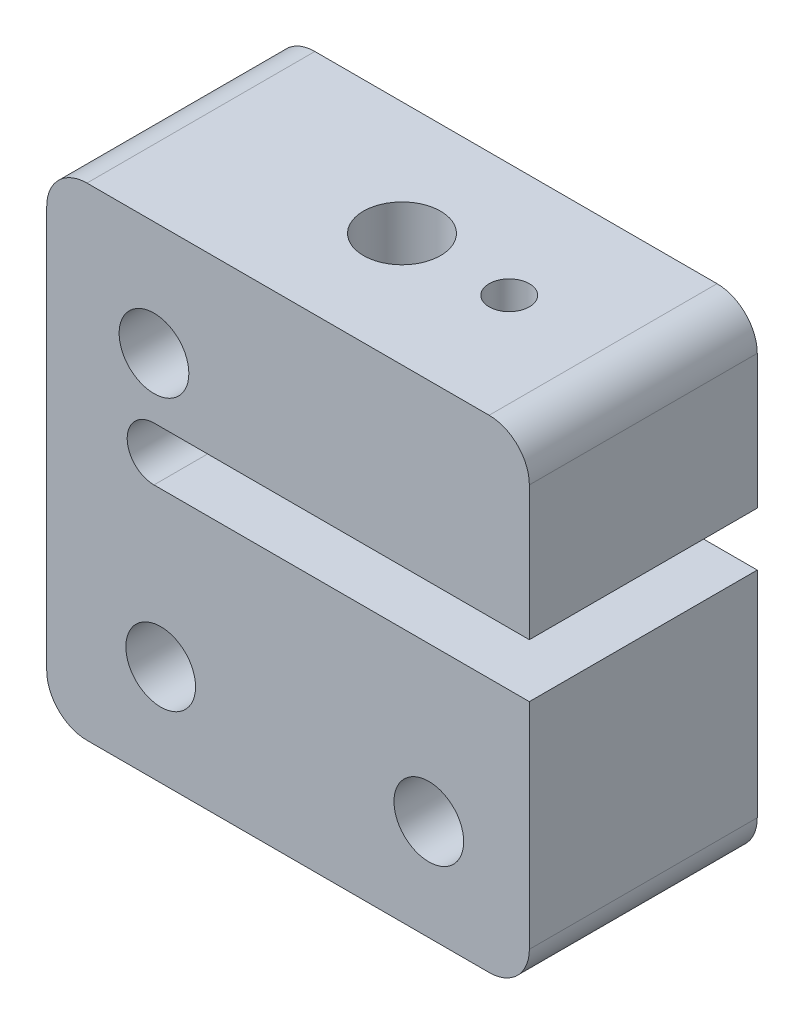
ISO-10303-21;
HEADER;
FILE_DESCRIPTION(('STEP AP214'),'2;1');
FILE_NAME('part.step','',(''),(''),'','','');
FILE_SCHEMA(('AUTOMOTIVE_DESIGN { 1 0 10303 214 1 1 1 1 }'));
ENDSEC;
DATA;
#1=APPLICATION_CONTEXT('core data for automotive mechanical design processes');
#2=APPLICATION_PROTOCOL_DEFINITION('international standard','automotive_design',2000,#1);
#3=PRODUCT_CONTEXT('',#1,'mechanical');
#4=PRODUCT('Part','Part','',(#3));
#5=PRODUCT_RELATED_PRODUCT_CATEGORY('part','',(#4));
#6=PRODUCT_DEFINITION_FORMATION('','',#4);
#7=PRODUCT_DEFINITION_CONTEXT('part definition',#1,'design');
#8=PRODUCT_DEFINITION('design','',#6,#7);
#9=PRODUCT_DEFINITION_SHAPE('','',#8);
#10=(LENGTH_UNIT() NAMED_UNIT(*) SI_UNIT(.MILLI.,.METRE.));
#11=(NAMED_UNIT(*) PLANE_ANGLE_UNIT() SI_UNIT($,.RADIAN.));
#12=(NAMED_UNIT(*) SI_UNIT($,.STERADIAN.) SOLID_ANGLE_UNIT());
#13=UNCERTAINTY_MEASURE_WITH_UNIT(LENGTH_MEASURE(1.E-05),#10,'distance_accuracy_value','');
#14=(GEOMETRIC_REPRESENTATION_CONTEXT(3) GLOBAL_UNCERTAINTY_ASSIGNED_CONTEXT((#13)) GLOBAL_UNIT_ASSIGNED_CONTEXT((#10,
#11,#12)) REPRESENTATION_CONTEXT('',''));
#15=CARTESIAN_POINT('',(0.,0.,0.));
#16=DIRECTION('',(0.,0.,1.));
#17=DIRECTION('',(1.,0.,0.));
#18=AXIS2_PLACEMENT_3D('',#15,#16,#17);
#19=CARTESIAN_POINT('',(26.,36.,8.5));
#20=DIRECTION('',(0.,-1.,0.));
#21=DIRECTION('',(0.,0.,-1.));
#22=AXIS2_PLACEMENT_3D('',#19,#20,#21);
#23=CYLINDRICAL_SURFACE('',#22,1.5);
#24=CARTESIAN_POINT('',(26.,36.,8.5));
#25=DIRECTION('',(0.,-1.,0.));
#26=DIRECTION('',(0.,0.,-1.));
#27=AXIS2_PLACEMENT_3D('',#24,#25,#26);
#28=CIRCLE('',#27,1.5);
#29=CARTESIAN_POINT('',(26.,36.,7.));
#30=VERTEX_POINT('',#29);
#31=EDGE_CURVE('E207',#30,#30,#28,.T.);
#32=ORIENTED_EDGE('',*,*,#31,.F.);
#33=EDGE_LOOP('',(#32));
#34=FACE_BOUND('',#33,.T.);
#35=CARTESIAN_POINT('',(26.,23.,8.5));
#36=DIRECTION('',(0.,-1.,0.));
#37=DIRECTION('',(0.,0.,-1.));
#38=AXIS2_PLACEMENT_3D('',#35,#36,#37);
#39=CIRCLE('',#38,1.5);
#40=CARTESIAN_POINT('',(26.,23.,7.));
#41=VERTEX_POINT('',#40);
#42=EDGE_CURVE('E215',#41,#41,#39,.F.);
#43=ORIENTED_EDGE('',*,*,#42,.F.);
#44=EDGE_LOOP('',(#43));
#45=FACE_BOUND('',#44,.T.);
#46=ADVANCED_FACE('F17',(#34,#45),#23,.F.);
#47=CARTESIAN_POINT('',(18.,-17.6749476012786,8.5));
#48=DIRECTION('',(0.,1.,0.));
#49=DIRECTION('',(-1.,0.,0.));
#50=AXIS2_PLACEMENT_3D('',#47,#48,#49);
#51=CYLINDRICAL_SURFACE('',#50,2.875);
#52=CARTESIAN_POINT('',(18.,23.,8.5));
#53=DIRECTION('',(0.,1.,0.));
#54=DIRECTION('',(-1.,0.,0.));
#55=AXIS2_PLACEMENT_3D('',#52,#53,#54);
#56=CIRCLE('',#55,2.875);
#57=CARTESIAN_POINT('',(15.125,23.,8.5));
#58=VERTEX_POINT('',#57);
#59=EDGE_CURVE('E157',#58,#58,#56,.T.);
#60=ORIENTED_EDGE('',*,*,#59,.F.);
#61=EDGE_LOOP('',(#60));
#62=FACE_BOUND('',#61,.T.);
#63=CARTESIAN_POINT('',(18.,36.,8.5));
#64=DIRECTION('',(0.,1.,0.));
#65=DIRECTION('',(-1.,0.,0.));
#66=AXIS2_PLACEMENT_3D('',#63,#64,#65);
#67=CIRCLE('',#66,2.875);
#68=CARTESIAN_POINT('',(15.125,36.,8.5));
#69=VERTEX_POINT('',#68);
#70=EDGE_CURVE('E204',#69,#69,#67,.F.);
#71=ORIENTED_EDGE('',*,*,#70,.F.);
#72=EDGE_LOOP('',(#71));
#73=FACE_BOUND('',#72,.T.);
#74=ADVANCED_FACE('F303',(#62,#73),#51,.F.);
#75=CARTESIAN_POINT('',(18.,-17.6749476012786,8.5));
#76=DIRECTION('',(0.,1.,0.));
#77=DIRECTION('',(-1.,0.,0.));
#78=AXIS2_PLACEMENT_3D('',#75,#76,#77);
#79=CYLINDRICAL_SURFACE('',#78,2.875);
#80=CARTESIAN_POINT('',(18.,19.,8.5));
#81=DIRECTION('',(0.,1.,0.));
#82=DIRECTION('',(-1.,0.,0.));
#83=AXIS2_PLACEMENT_3D('',#80,#81,#82);
#84=CIRCLE('',#83,2.875);
#85=CARTESIAN_POINT('',(15.125,19.,8.5));
#86=VERTEX_POINT('',#85);
#87=EDGE_CURVE('E20',#86,#86,#84,.F.);
#88=ORIENTED_EDGE('',*,*,#87,.F.);
#89=EDGE_LOOP('',(#88));
#90=FACE_BOUND('',#89,.T.);
#91=CARTESIAN_POINT('',(18.,0.,8.5));
#92=DIRECTION('',(0.,1.,0.));
#93=DIRECTION('',(-1.,0.,0.));
#94=AXIS2_PLACEMENT_3D('',#91,#92,#93);
#95=CIRCLE('',#94,2.875);
#96=CARTESIAN_POINT('',(15.125,0.,8.5));
#97=VERTEX_POINT('',#96);
#98=EDGE_CURVE('E138',#97,#97,#95,.T.);
#99=ORIENTED_EDGE('',*,*,#98,.F.);
#100=EDGE_LOOP('',(#99));
#101=FACE_BOUND('',#100,.T.);
#102=ADVANCED_FACE('F309',(#90,#101),#79,.F.);
#103=CARTESIAN_POINT('',(18.4051514906693,18.864380080114,17.));
#104=DIRECTION('',(0.,0.,1.));
#105=DIRECTION('',(1.,0.,0.));
#106=AXIS2_PLACEMENT_3D('',#103,#104,#105);
#107=PLANE('',#106);
#108=CARTESIAN_POINT('',(3.,3.,17.));
#109=DIRECTION('',(0.,0.,1.));
#110=DIRECTION('',(1.,0.,0.));
#111=AXIS2_PLACEMENT_3D('',#108,#109,#110);
#112=CIRCLE('',#111,3.);
#113=CARTESIAN_POINT('',(3.,0.,17.));
#114=VERTEX_POINT('',#113);
#115=CARTESIAN_POINT('',(0.,3.,17.));
#116=VERTEX_POINT('',#115);
#117=EDGE_CURVE('E201',#114,#116,#112,.F.);
#118=ORIENTED_EDGE('',*,*,#117,.F.);
#119=DIRECTION('',(1.,0.,0.));
#120=VECTOR('',#119,1.);
#121=CARTESIAN_POINT('',(18.,0.,17.));
#122=LINE('',#121,#120);
#123=CARTESIAN_POINT('',(33.,0.,17.));
#124=VERTEX_POINT('',#123);
#125=EDGE_CURVE('E135',#124,#114,#122,.F.);
#126=ORIENTED_EDGE('',*,*,#125,.F.);
#127=CARTESIAN_POINT('',(33.,3.,17.));
#128=DIRECTION('',(0.,0.,1.));
#129=DIRECTION('',(1.,0.,0.));
#130=AXIS2_PLACEMENT_3D('',#127,#128,#129);
#131=CIRCLE('',#130,3.);
#132=CARTESIAN_POINT('',(36.,3.,17.));
#133=VERTEX_POINT('',#132);
#134=EDGE_CURVE('E118',#133,#124,#131,.F.);
#135=ORIENTED_EDGE('',*,*,#134,.F.);
#136=DIRECTION('',(0.,1.,0.));
#137=VECTOR('',#136,1.);
#138=CARTESIAN_POINT('',(36.,9.5,17.));
#139=LINE('',#138,#137);
#140=CARTESIAN_POINT('',(36.,19.,17.));
#141=VERTEX_POINT('',#140);
#142=EDGE_CURVE('E113',#141,#133,#139,.F.);
#143=ORIENTED_EDGE('',*,*,#142,.F.);
#144=DIRECTION('',(-1.,0.,0.));
#145=VECTOR('',#144,1.);
#146=CARTESIAN_POINT('',(22.,19.,17.));
#147=LINE('',#146,#145);
#148=CARTESIAN_POINT('',(8.,19.,17.));
#149=VERTEX_POINT('',#148);
#150=EDGE_CURVE('E98',#149,#141,#147,.F.);
#151=ORIENTED_EDGE('',*,*,#150,.F.);
#152=CARTESIAN_POINT('',(8.,21.,17.));
#153=DIRECTION('',(0.,0.,1.));
#154=DIRECTION('',(1.,0.,0.));
#155=AXIS2_PLACEMENT_3D('',#152,#153,#154);
#156=CIRCLE('',#155,2.);
#157=CARTESIAN_POINT('',(8.,23.,17.));
#158=VERTEX_POINT('',#157);
#159=EDGE_CURVE('E127',#149,#158,#156,.F.);
#160=ORIENTED_EDGE('',*,*,#159,.T.);
#161=DIRECTION('',(1.,0.,0.));
#162=VECTOR('',#161,1.);
#163=CARTESIAN_POINT('',(22.,23.,17.));
#164=LINE('',#163,#162);
#165=CARTESIAN_POINT('',(36.,23.,17.));
#166=VERTEX_POINT('',#165);
#167=EDGE_CURVE('E155',#166,#158,#164,.F.);
#168=ORIENTED_EDGE('',*,*,#167,.F.);
#169=DIRECTION('',(0.,1.,0.));
#170=VECTOR('',#169,1.);
#171=CARTESIAN_POINT('',(36.,29.5,17.));
#172=LINE('',#171,#170);
#173=CARTESIAN_POINT('',(36.,33.,17.));
#174=VERTEX_POINT('',#173);
#175=EDGE_CURVE('E148',#174,#166,#172,.F.);
#176=ORIENTED_EDGE('',*,*,#175,.F.);
#177=CARTESIAN_POINT('',(33.,33.,17.));
#178=DIRECTION('',(0.,0.,1.));
#179=DIRECTION('',(1.,0.,0.));
#180=AXIS2_PLACEMENT_3D('',#177,#178,#179);
#181=CIRCLE('',#180,3.);
#182=CARTESIAN_POINT('',(33.,36.,17.));
#183=VERTEX_POINT('',#182);
#184=EDGE_CURVE('E211',#183,#174,#181,.F.);
#185=ORIENTED_EDGE('',*,*,#184,.F.);
#186=DIRECTION('',(-1.,0.,0.));
#187=VECTOR('',#186,1.);
#188=CARTESIAN_POINT('',(18.,36.,17.));
#189=LINE('',#188,#187);
#190=CARTESIAN_POINT('',(3.,36.,17.));
#191=VERTEX_POINT('',#190);
#192=EDGE_CURVE('E143',#191,#183,#189,.F.);
#193=ORIENTED_EDGE('',*,*,#192,.F.);
#194=CARTESIAN_POINT('',(3.,33.,17.));
#195=DIRECTION('',(0.,0.,1.));
#196=DIRECTION('',(1.,0.,0.));
#197=AXIS2_PLACEMENT_3D('',#194,#195,#196);
#198=CIRCLE('',#197,3.);
#199=CARTESIAN_POINT('',(0.,33.,17.));
#200=VERTEX_POINT('',#199);
#201=EDGE_CURVE('E146',#200,#191,#198,.F.);
#202=ORIENTED_EDGE('',*,*,#201,.F.);
#203=DIRECTION('',(0.,-1.,0.));
#204=VECTOR('',#203,1.);
#205=CARTESIAN_POINT('',(0.,18.,17.));
#206=LINE('',#205,#204);
#207=EDGE_CURVE('E139',#116,#200,#206,.F.);
#208=ORIENTED_EDGE('',*,*,#207,.F.);
#209=EDGE_LOOP('',(#118,#126,#135,#143,#151,#160,#168,#176,#185,#193,#202,#208));
#210=FACE_BOUND('',#209,.T.);
#211=CARTESIAN_POINT('',(8.5,7.5,17.));
#212=DIRECTION('',(0.,0.,1.));
#213=DIRECTION('',(1.,0.,0.));
#214=AXIS2_PLACEMENT_3D('',#211,#212,#213);
#215=CIRCLE('',#214,2.6);
#216=CARTESIAN_POINT('',(11.1,7.5,17.));
#217=VERTEX_POINT('',#216);
#218=EDGE_CURVE('E187',#217,#217,#215,.F.);
#219=ORIENTED_EDGE('',*,*,#218,.T.);
#220=EDGE_LOOP('',(#219));
#221=FACE_BOUND('',#220,.T.);
#222=CARTESIAN_POINT('',(28.5,7.5,17.));
#223=DIRECTION('',(0.,0.,1.));
#224=DIRECTION('',(1.,0.,0.));
#225=AXIS2_PLACEMENT_3D('',#222,#223,#224);
#226=CIRCLE('',#225,2.6);
#227=CARTESIAN_POINT('',(31.1,7.5,17.));
#228=VERTEX_POINT('',#227);
#229=EDGE_CURVE('E190',#228,#228,#226,.F.);
#230=ORIENTED_EDGE('',*,*,#229,.T.);
#231=EDGE_LOOP('',(#230));
#232=FACE_BOUND('',#231,.T.);
#233=CARTESIAN_POINT('',(8.,27.5,17.));
#234=DIRECTION('',(0.,0.,1.));
#235=DIRECTION('',(1.,0.,0.));
#236=AXIS2_PLACEMENT_3D('',#233,#234,#235);
#237=CIRCLE('',#236,2.6);
#238=CARTESIAN_POINT('',(10.6,27.5,17.));
#239=VERTEX_POINT('',#238);
#240=EDGE_CURVE('E193',#239,#239,#237,.F.);
#241=ORIENTED_EDGE('',*,*,#240,.T.);
#242=EDGE_LOOP('',(#241));
#243=FACE_BOUND('',#242,.T.);
#244=ADVANCED_FACE('F115',(#210,#221,#232,#243),#107,.T.);
#245=CARTESIAN_POINT('',(36.,9.5,0.));
#246=DIRECTION('',(1.,0.,0.));
#247=DIRECTION('',(0.,1.,0.));
#248=AXIS2_PLACEMENT_3D('',#245,#246,#247);
#249=PLANE('',#248);
#250=DIRECTION('',(0.,0.,1.));
#251=VECTOR('',#250,1.);
#252=CARTESIAN_POINT('',(36.,19.,0.));
#253=LINE('',#252,#251);
#254=CARTESIAN_POINT('',(36.,19.,0.));
#255=VERTEX_POINT('',#254);
#256=EDGE_CURVE('E108',#141,#255,#253,.F.);
#257=ORIENTED_EDGE('',*,*,#256,.F.);
#258=ORIENTED_EDGE('',*,*,#142,.T.);
#259=DIRECTION('',(0.,0.,1.));
#260=VECTOR('',#259,1.);
#261=CARTESIAN_POINT('',(36.,3.,0.));
#262=LINE('',#261,#260);
#263=CARTESIAN_POINT('',(36.,3.,0.));
#264=VERTEX_POINT('',#263);
#265=EDGE_CURVE('E196',#264,#133,#262,.T.);
#266=ORIENTED_EDGE('',*,*,#265,.F.);
#267=DIRECTION('',(0.,1.,0.));
#268=VECTOR('',#267,1.);
#269=CARTESIAN_POINT('',(36.,18.864380080114,0.));
#270=LINE('',#269,#268);
#271=EDGE_CURVE('E125',#264,#255,#270,.T.);
#272=ORIENTED_EDGE('',*,*,#271,.T.);
#273=EDGE_LOOP('',(#257,#258,#266,#272));
#274=FACE_BOUND('',#273,.T.);
#275=ADVANCED_FACE('F124',(#274),#249,.T.);
#276=CARTESIAN_POINT('',(22.,19.,0.));
#277=DIRECTION('',(0.,1.,0.));
#278=DIRECTION('',(-1.,0.,0.));
#279=AXIS2_PLACEMENT_3D('',#276,#277,#278);
#280=PLANE('',#279);
#281=DIRECTION('',(1.,0.,0.));
#282=VECTOR('',#281,1.);
#283=CARTESIAN_POINT('',(18.4051514906693,19.,0.));
#284=LINE('',#283,#282);
#285=CARTESIAN_POINT('',(8.,19.,0.));
#286=VERTEX_POINT('',#285);
#287=EDGE_CURVE('E186',#255,#286,#284,.F.);
#288=ORIENTED_EDGE('',*,*,#287,.T.);
#289=DIRECTION('',(0.,0.,1.));
#290=VECTOR('',#289,1.);
#291=CARTESIAN_POINT('',(8.,19.,0.));
#292=LINE('',#291,#290);
#293=EDGE_CURVE('E110',#286,#149,#292,.T.);
#294=ORIENTED_EDGE('',*,*,#293,.T.);
#295=ORIENTED_EDGE('',*,*,#150,.T.);
#296=ORIENTED_EDGE('',*,*,#256,.T.);
#297=EDGE_LOOP('',(#288,#294,#295,#296));
#298=FACE_BOUND('',#297,.T.);
#299=ORIENTED_EDGE('',*,*,#87,.T.);
#300=EDGE_LOOP('',(#299));
#301=FACE_BOUND('',#300,.T.);
#302=ADVANCED_FACE('F105',(#298,#301),#280,.T.);
#303=CARTESIAN_POINT('',(8.,21.,0.));
#304=DIRECTION('',(0.,0.,1.));
#305=DIRECTION('',(1.,0.,0.));
#306=AXIS2_PLACEMENT_3D('',#303,#304,#305);
#307=CYLINDRICAL_SURFACE('',#306,2.);
#308=ORIENTED_EDGE('',*,*,#293,.F.);
#309=CARTESIAN_POINT('',(8.,21.,0.));
#310=DIRECTION('',(0.,0.,1.));
#311=DIRECTION('',(1.,0.,0.));
#312=AXIS2_PLACEMENT_3D('',#309,#310,#311);
#313=CIRCLE('',#312,2.);
#314=CARTESIAN_POINT('',(8.,23.,0.));
#315=VERTEX_POINT('',#314);
#316=EDGE_CURVE('E182',#286,#315,#313,.F.);
#317=ORIENTED_EDGE('',*,*,#316,.T.);
#318=DIRECTION('',(0.,0.,1.));
#319=VECTOR('',#318,1.);
#320=CARTESIAN_POINT('',(8.,23.,0.));
#321=LINE('',#320,#319);
#322=EDGE_CURVE('E152',#158,#315,#321,.F.);
#323=ORIENTED_EDGE('',*,*,#322,.F.);
#324=ORIENTED_EDGE('',*,*,#159,.F.);
#325=EDGE_LOOP('',(#308,#317,#323,#324));
#326=FACE_BOUND('',#325,.T.);
#327=ADVANCED_FACE('F222',(#326),#307,.F.);
#328=CARTESIAN_POINT('',(22.,23.,0.));
#329=DIRECTION('',(0.,-1.,0.));
#330=DIRECTION('',(1.,0.,0.));
#331=AXIS2_PLACEMENT_3D('',#328,#329,#330);
#332=PLANE('',#331);
#333=DIRECTION('',(1.,0.,0.));
#334=VECTOR('',#333,1.);
#335=CARTESIAN_POINT('',(18.4051514906693,23.,0.));
#336=LINE('',#335,#334);
#337=CARTESIAN_POINT('',(36.,23.,0.));
#338=VERTEX_POINT('',#337);
#339=EDGE_CURVE('E185',#315,#338,#336,.T.);
#340=ORIENTED_EDGE('',*,*,#339,.T.);
#341=DIRECTION('',(0.,0.,1.));
#342=VECTOR('',#341,1.);
#343=CARTESIAN_POINT('',(36.,23.,0.));
#344=LINE('',#343,#342);
#345=EDGE_CURVE('E151',#166,#338,#344,.F.);
#346=ORIENTED_EDGE('',*,*,#345,.F.);
#347=ORIENTED_EDGE('',*,*,#167,.T.);
#348=ORIENTED_EDGE('',*,*,#322,.T.);
#349=EDGE_LOOP('',(#340,#346,#347,#348));
#350=FACE_BOUND('',#349,.T.);
#351=ORIENTED_EDGE('',*,*,#59,.T.);
#352=EDGE_LOOP('',(#351));
#353=FACE_BOUND('',#352,.T.);
#354=ORIENTED_EDGE('',*,*,#42,.T.);
#355=EDGE_LOOP('',(#354));
#356=FACE_BOUND('',#355,.T.);
#357=ADVANCED_FACE('F293',(#350,#353,#356),#332,.T.);
#358=CARTESIAN_POINT('',(36.,29.5,0.));
#359=DIRECTION('',(1.,0.,0.));
#360=DIRECTION('',(0.,1.,0.));
#361=AXIS2_PLACEMENT_3D('',#358,#359,#360);
#362=PLANE('',#361);
#363=ORIENTED_EDGE('',*,*,#345,.T.);
#364=DIRECTION('',(0.,1.,0.));
#365=VECTOR('',#364,1.);
#366=CARTESIAN_POINT('',(36.,18.864380080114,0.));
#367=LINE('',#366,#365);
#368=CARTESIAN_POINT('',(36.,33.,0.));
#369=VERTEX_POINT('',#368);
#370=EDGE_CURVE('E181',#338,#369,#367,.T.);
#371=ORIENTED_EDGE('',*,*,#370,.T.);
#372=DIRECTION('',(0.,0.,1.));
#373=VECTOR('',#372,1.);
#374=CARTESIAN_POINT('',(36.,33.,0.));
#375=LINE('',#374,#373);
#376=EDGE_CURVE('E210',#174,#369,#375,.F.);
#377=ORIENTED_EDGE('',*,*,#376,.F.);
#378=ORIENTED_EDGE('',*,*,#175,.T.);
#379=EDGE_LOOP('',(#363,#371,#377,#378));
#380=FACE_BOUND('',#379,.T.);
#381=ADVANCED_FACE('F291',(#380),#362,.T.);
#382=CARTESIAN_POINT('',(33.,33.,0.));
#383=DIRECTION('',(0.,0.,1.));
#384=DIRECTION('',(1.,0.,0.));
#385=AXIS2_PLACEMENT_3D('',#382,#383,#384);
#386=CYLINDRICAL_SURFACE('',#385,3.);
#387=CARTESIAN_POINT('',(33.,33.,0.));
#388=DIRECTION('',(0.,0.,1.));
#389=DIRECTION('',(1.,0.,0.));
#390=AXIS2_PLACEMENT_3D('',#387,#388,#389);
#391=CIRCLE('',#390,3.);
#392=CARTESIAN_POINT('',(33.,36.,0.));
#393=VERTEX_POINT('',#392);
#394=EDGE_CURVE('E178',#369,#393,#391,.T.);
#395=ORIENTED_EDGE('',*,*,#394,.T.);
#396=DIRECTION('',(0.,0.,1.));
#397=VECTOR('',#396,1.);
#398=CARTESIAN_POINT('',(33.,36.,0.));
#399=LINE('',#398,#397);
#400=EDGE_CURVE('E147',#183,#393,#399,.F.);
#401=ORIENTED_EDGE('',*,*,#400,.F.);
#402=ORIENTED_EDGE('',*,*,#184,.T.);
#403=ORIENTED_EDGE('',*,*,#376,.T.);
#404=EDGE_LOOP('',(#395,#401,#402,#403));
#405=FACE_BOUND('',#404,.T.);
#406=ADVANCED_FACE('F288',(#405),#386,.T.);
#407=CARTESIAN_POINT('',(18.,36.,0.));
#408=DIRECTION('',(0.,1.,0.));
#409=DIRECTION('',(-1.,0.,0.));
#410=AXIS2_PLACEMENT_3D('',#407,#408,#409);
#411=PLANE('',#410);
#412=DIRECTION('',(0.,0.,1.));
#413=VECTOR('',#412,1.);
#414=CARTESIAN_POINT('',(3.,36.,0.));
#415=LINE('',#414,#413);
#416=CARTESIAN_POINT('',(3.,36.,0.));
#417=VERTEX_POINT('',#416);
#418=EDGE_CURVE('E142',#191,#417,#415,.F.);
#419=ORIENTED_EDGE('',*,*,#418,.F.);
#420=ORIENTED_EDGE('',*,*,#192,.T.);
#421=ORIENTED_EDGE('',*,*,#400,.T.);
#422=DIRECTION('',(1.,0.,0.));
#423=VECTOR('',#422,1.);
#424=CARTESIAN_POINT('',(18.4051514906693,36.,0.));
#425=LINE('',#424,#423);
#426=EDGE_CURVE('E177',#393,#417,#425,.F.);
#427=ORIENTED_EDGE('',*,*,#426,.T.);
#428=EDGE_LOOP('',(#419,#420,#421,#427));
#429=FACE_BOUND('',#428,.T.);
#430=ORIENTED_EDGE('',*,*,#70,.T.);
#431=EDGE_LOOP('',(#430));
#432=FACE_BOUND('',#431,.T.);
#433=ORIENTED_EDGE('',*,*,#31,.T.);
#434=EDGE_LOOP('',(#433));
#435=FACE_BOUND('',#434,.T.);
#436=ADVANCED_FACE('F282',(#429,#432,#435),#411,.T.);
#437=CARTESIAN_POINT('',(3.,33.,0.));
#438=DIRECTION('',(0.,0.,1.));
#439=DIRECTION('',(1.,0.,0.));
#440=AXIS2_PLACEMENT_3D('',#437,#438,#439);
#441=CYLINDRICAL_SURFACE('',#440,3.);
#442=CARTESIAN_POINT('',(3.,33.,0.));
#443=DIRECTION('',(0.,0.,1.));
#444=DIRECTION('',(1.,0.,0.));
#445=AXIS2_PLACEMENT_3D('',#442,#443,#444);
#446=CIRCLE('',#445,3.);
#447=CARTESIAN_POINT('',(0.,33.,0.));
#448=VERTEX_POINT('',#447);
#449=EDGE_CURVE('E174',#417,#448,#446,.T.);
#450=ORIENTED_EDGE('',*,*,#449,.T.);
#451=DIRECTION('',(0.,0.,1.));
#452=VECTOR('',#451,1.);
#453=CARTESIAN_POINT('',(0.,33.,0.));
#454=LINE('',#453,#452);
#455=EDGE_CURVE('E141',#200,#448,#454,.F.);
#456=ORIENTED_EDGE('',*,*,#455,.F.);
#457=ORIENTED_EDGE('',*,*,#201,.T.);
#458=ORIENTED_EDGE('',*,*,#418,.T.);
#459=EDGE_LOOP('',(#450,#456,#457,#458));
#460=FACE_BOUND('',#459,.T.);
#461=ADVANCED_FACE('F278',(#460),#441,.T.);
#462=CARTESIAN_POINT('',(0.,18.,0.));
#463=DIRECTION('',(-1.,0.,0.));
#464=DIRECTION('',(0.,-1.,0.));
#465=AXIS2_PLACEMENT_3D('',#462,#463,#464);
#466=PLANE('',#465);
#467=ORIENTED_EDGE('',*,*,#455,.T.);
#468=DIRECTION('',(0.,1.,0.));
#469=VECTOR('',#468,1.);
#470=CARTESIAN_POINT('',(0.,18.864380080114,0.));
#471=LINE('',#470,#469);
#472=CARTESIAN_POINT('',(0.,3.,0.));
#473=VERTEX_POINT('',#472);
#474=EDGE_CURVE('E173',#448,#473,#471,.F.);
#475=ORIENTED_EDGE('',*,*,#474,.T.);
#476=DIRECTION('',(0.,0.,1.));
#477=VECTOR('',#476,1.);
#478=CARTESIAN_POINT('',(0.,3.,0.));
#479=LINE('',#478,#477);
#480=EDGE_CURVE('E200',#116,#473,#479,.F.);
#481=ORIENTED_EDGE('',*,*,#480,.F.);
#482=ORIENTED_EDGE('',*,*,#207,.T.);
#483=EDGE_LOOP('',(#467,#475,#481,#482));
#484=FACE_BOUND('',#483,.T.);
#485=ADVANCED_FACE('F272',(#484),#466,.T.);
#486=CARTESIAN_POINT('',(3.,3.,0.));
#487=DIRECTION('',(0.,0.,1.));
#488=DIRECTION('',(1.,0.,0.));
#489=AXIS2_PLACEMENT_3D('',#486,#487,#488);
#490=CYLINDRICAL_SURFACE('',#489,3.);
#491=CARTESIAN_POINT('',(3.,3.,0.));
#492=DIRECTION('',(0.,0.,1.));
#493=DIRECTION('',(1.,0.,0.));
#494=AXIS2_PLACEMENT_3D('',#491,#492,#493);
#495=CIRCLE('',#494,3.);
#496=CARTESIAN_POINT('',(3.,0.,0.));
#497=VERTEX_POINT('',#496);
#498=EDGE_CURVE('E170',#473,#497,#495,.T.);
#499=ORIENTED_EDGE('',*,*,#498,.T.);
#500=DIRECTION('',(0.,0.,-1.));
#501=VECTOR('',#500,1.);
#502=CARTESIAN_POINT('',(3.,0.,0.));
#503=LINE('',#502,#501);
#504=EDGE_CURVE('E137',#114,#497,#503,.T.);
#505=ORIENTED_EDGE('',*,*,#504,.F.);
#506=ORIENTED_EDGE('',*,*,#117,.T.);
#507=ORIENTED_EDGE('',*,*,#480,.T.);
#508=EDGE_LOOP('',(#499,#505,#506,#507));
#509=FACE_BOUND('',#508,.T.);
#510=ADVANCED_FACE('F268',(#509),#490,.T.);
#511=CARTESIAN_POINT('',(18.,0.,0.));
#512=DIRECTION('',(0.,-1.,0.));
#513=DIRECTION('',(0.,0.,-1.));
#514=AXIS2_PLACEMENT_3D('',#511,#512,#513);
#515=PLANE('',#514);
#516=ORIENTED_EDGE('',*,*,#504,.T.);
#517=DIRECTION('',(1.,0.,0.));
#518=VECTOR('',#517,1.);
#519=CARTESIAN_POINT('',(18.4051514906693,0.,0.));
#520=LINE('',#519,#518);
#521=CARTESIAN_POINT('',(33.,0.,0.));
#522=VERTEX_POINT('',#521);
#523=EDGE_CURVE('E169',#497,#522,#520,.T.);
#524=ORIENTED_EDGE('',*,*,#523,.T.);
#525=DIRECTION('',(0.,0.,1.));
#526=VECTOR('',#525,1.);
#527=CARTESIAN_POINT('',(33.,0.,0.));
#528=LINE('',#527,#526);
#529=EDGE_CURVE('E35',#124,#522,#528,.F.);
#530=ORIENTED_EDGE('',*,*,#529,.F.);
#531=ORIENTED_EDGE('',*,*,#125,.T.);
#532=EDGE_LOOP('',(#516,#524,#530,#531));
#533=FACE_BOUND('',#532,.T.);
#534=ORIENTED_EDGE('',*,*,#98,.T.);
#535=EDGE_LOOP('',(#534));
#536=FACE_BOUND('',#535,.T.);
#537=ADVANCED_FACE('F260',(#533,#536),#515,.T.);
#538=CARTESIAN_POINT('',(33.,3.,0.));
#539=DIRECTION('',(0.,0.,1.));
#540=DIRECTION('',(1.,0.,0.));
#541=AXIS2_PLACEMENT_3D('',#538,#539,#540);
#542=CYLINDRICAL_SURFACE('',#541,3.);
#543=CARTESIAN_POINT('',(33.,3.,0.));
#544=DIRECTION('',(0.,0.,1.));
#545=DIRECTION('',(1.,0.,0.));
#546=AXIS2_PLACEMENT_3D('',#543,#544,#545);
#547=CIRCLE('',#546,3.);
#548=EDGE_CURVE('E167',#522,#264,#547,.T.);
#549=ORIENTED_EDGE('',*,*,#548,.T.);
#550=ORIENTED_EDGE('',*,*,#265,.T.);
#551=ORIENTED_EDGE('',*,*,#134,.T.);
#552=ORIENTED_EDGE('',*,*,#529,.T.);
#553=EDGE_LOOP('',(#549,#550,#551,#552));
#554=FACE_BOUND('',#553,.T.);
#555=ADVANCED_FACE('F331',(#554),#542,.T.);
#556=CARTESIAN_POINT('',(8.,27.5,0.));
#557=DIRECTION('',(0.,0.,1.));
#558=DIRECTION('',(1.,0.,0.));
#559=AXIS2_PLACEMENT_3D('',#556,#557,#558);
#560=CYLINDRICAL_SURFACE('',#559,2.6);
#561=CARTESIAN_POINT('',(8.,27.5,0.));
#562=DIRECTION('',(0.,0.,1.));
#563=DIRECTION('',(1.,0.,0.));
#564=AXIS2_PLACEMENT_3D('',#561,#562,#563);
#565=CIRCLE('',#564,2.6);
#566=CARTESIAN_POINT('',(10.6,27.5,0.));
#567=VERTEX_POINT('',#566);
#568=EDGE_CURVE('E164',#567,#567,#565,.F.);
#569=ORIENTED_EDGE('',*,*,#568,.T.);
#570=EDGE_LOOP('',(#569));
#571=FACE_BOUND('',#570,.T.);
#572=ORIENTED_EDGE('',*,*,#240,.F.);
#573=EDGE_LOOP('',(#572));
#574=FACE_BOUND('',#573,.T.);
#575=ADVANCED_FACE('F327',(#571,#574),#560,.F.);
#576=CARTESIAN_POINT('',(28.5,7.5,0.));
#577=DIRECTION('',(0.,0.,1.));
#578=DIRECTION('',(1.,0.,0.));
#579=AXIS2_PLACEMENT_3D('',#576,#577,#578);
#580=CYLINDRICAL_SURFACE('',#579,2.6);
#581=CARTESIAN_POINT('',(28.5,7.5,0.));
#582=DIRECTION('',(0.,0.,1.));
#583=DIRECTION('',(1.,0.,0.));
#584=AXIS2_PLACEMENT_3D('',#581,#582,#583);
#585=CIRCLE('',#584,2.6);
#586=CARTESIAN_POINT('',(31.1,7.5,0.));
#587=VERTEX_POINT('',#586);
#588=EDGE_CURVE('E26',#587,#587,#585,.F.);
#589=ORIENTED_EDGE('',*,*,#588,.T.);
#590=EDGE_LOOP('',(#589));
#591=FACE_BOUND('',#590,.T.);
#592=ORIENTED_EDGE('',*,*,#229,.F.);
#593=EDGE_LOOP('',(#592));
#594=FACE_BOUND('',#593,.T.);
#595=ADVANCED_FACE('F319',(#591,#594),#580,.F.);
#596=CARTESIAN_POINT('',(8.5,7.5,0.));
#597=DIRECTION('',(0.,0.,1.));
#598=DIRECTION('',(1.,0.,0.));
#599=AXIS2_PLACEMENT_3D('',#596,#597,#598);
#600=CYLINDRICAL_SURFACE('',#599,2.6);
#601=CARTESIAN_POINT('',(8.5,7.5,0.));
#602=DIRECTION('',(0.,0.,1.));
#603=DIRECTION('',(1.,0.,0.));
#604=AXIS2_PLACEMENT_3D('',#601,#602,#603);
#605=CIRCLE('',#604,2.6);
#606=CARTESIAN_POINT('',(11.1,7.5,0.));
#607=VERTEX_POINT('',#606);
#608=EDGE_CURVE('E11',#607,#607,#605,.F.);
#609=ORIENTED_EDGE('',*,*,#608,.T.);
#610=EDGE_LOOP('',(#609));
#611=FACE_BOUND('',#610,.T.);
#612=ORIENTED_EDGE('',*,*,#218,.F.);
#613=EDGE_LOOP('',(#612));
#614=FACE_BOUND('',#613,.T.);
#615=ADVANCED_FACE('F313',(#611,#614),#600,.F.);
#616=CARTESIAN_POINT('',(18.4051514906693,18.864380080114,0.));
#617=DIRECTION('',(0.,0.,1.));
#618=DIRECTION('',(1.,0.,0.));
#619=AXIS2_PLACEMENT_3D('',#616,#617,#618);
#620=PLANE('',#619);
#621=ORIENTED_EDGE('',*,*,#608,.F.);
#622=EDGE_LOOP('',(#621));
#623=FACE_BOUND('',#622,.T.);
#624=ORIENTED_EDGE('',*,*,#588,.F.);
#625=EDGE_LOOP('',(#624));
#626=FACE_BOUND('',#625,.T.);
#627=ORIENTED_EDGE('',*,*,#568,.F.);
#628=EDGE_LOOP('',(#627));
#629=FACE_BOUND('',#628,.T.);
#630=ORIENTED_EDGE('',*,*,#523,.F.);
#631=ORIENTED_EDGE('',*,*,#498,.F.);
#632=ORIENTED_EDGE('',*,*,#474,.F.);
#633=ORIENTED_EDGE('',*,*,#449,.F.);
#634=ORIENTED_EDGE('',*,*,#426,.F.);
#635=ORIENTED_EDGE('',*,*,#394,.F.);
#636=ORIENTED_EDGE('',*,*,#370,.F.);
#637=ORIENTED_EDGE('',*,*,#339,.F.);
#638=ORIENTED_EDGE('',*,*,#316,.F.);
#639=ORIENTED_EDGE('',*,*,#287,.F.);
#640=ORIENTED_EDGE('',*,*,#271,.F.);
#641=ORIENTED_EDGE('',*,*,#548,.F.);
#642=EDGE_LOOP('',(#630,#631,#632,#633,#634,#635,#636,#637,#638,#639,#640,#641));
#643=FACE_BOUND('',#642,.T.);
#644=ADVANCED_FACE('F265',(#623,#626,#629,#643),#620,.F.);
#645=CLOSED_SHELL('',(#46,#74,#102,#244,#275,#302,#327,#357,#381,#406,#436,#461,#485,#510,#537,
#555,#575,#595,#615,#644));
#646=MANIFOLD_SOLID_BREP('B1',#645);
#647=ADVANCED_BREP_SHAPE_REPRESENTATION('',(#18,#646),#14);
#648=SHAPE_DEFINITION_REPRESENTATION(#9,#647);
ENDSEC;
END-ISO-10303-21;
